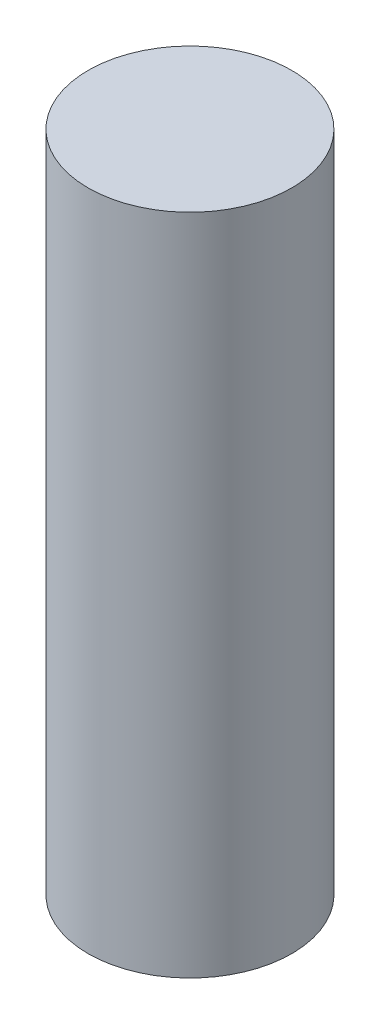
ISO-10303-21;
HEADER;
FILE_DESCRIPTION(('STEP AP214'),'2;1');
FILE_NAME('part.step','',(''),(''),'','','');
FILE_SCHEMA(('AUTOMOTIVE_DESIGN { 1 0 10303 214 1 1 1 1 }'));
ENDSEC;
DATA;
#1=APPLICATION_CONTEXT('core data for automotive mechanical design processes');
#2=APPLICATION_PROTOCOL_DEFINITION('international standard','automotive_design',2000,#1);
#3=PRODUCT_CONTEXT('',#1,'mechanical');
#4=PRODUCT('Part','Part','',(#3));
#5=PRODUCT_RELATED_PRODUCT_CATEGORY('part','',(#4));
#6=PRODUCT_DEFINITION_FORMATION('','',#4);
#7=PRODUCT_DEFINITION_CONTEXT('part definition',#1,'design');
#8=PRODUCT_DEFINITION('design','',#6,#7);
#9=PRODUCT_DEFINITION_SHAPE('','',#8);
#10=(LENGTH_UNIT() NAMED_UNIT(*) SI_UNIT(.MILLI.,.METRE.));
#11=(NAMED_UNIT(*) PLANE_ANGLE_UNIT() SI_UNIT($,.RADIAN.));
#12=(NAMED_UNIT(*) SI_UNIT($,.STERADIAN.) SOLID_ANGLE_UNIT());
#13=UNCERTAINTY_MEASURE_WITH_UNIT(LENGTH_MEASURE(1.E-05),#10,'distance_accuracy_value','');
#14=(GEOMETRIC_REPRESENTATION_CONTEXT(3) GLOBAL_UNCERTAINTY_ASSIGNED_CONTEXT((#13)) GLOBAL_UNIT_ASSIGNED_CONTEXT((#10,
#11,#12)) REPRESENTATION_CONTEXT('',''));
#15=CARTESIAN_POINT('',(0.,0.,0.));
#16=DIRECTION('',(0.,0.,1.));
#17=DIRECTION('',(1.,0.,0.));
#18=AXIS2_PLACEMENT_3D('',#15,#16,#17);
#19=CARTESIAN_POINT('',(0.,26.05,0.));
#20=DIRECTION('',(0.,-1.,0.));
#21=DIRECTION('',(0.,0.,-1.));
#22=AXIS2_PLACEMENT_3D('',#19,#20,#21);
#23=CYLINDRICAL_SURFACE('',#22,4.);
#24=CARTESIAN_POINT('',(0.,26.05,0.));
#25=DIRECTION('',(0.,1.,0.));
#26=DIRECTION('',(0.,0.,1.));
#27=AXIS2_PLACEMENT_3D('',#24,#25,#26);
#28=CIRCLE('',#27,4.);
#29=CARTESIAN_POINT('',(0.,26.05,4.));
#30=VERTEX_POINT('',#29);
#31=EDGE_CURVE('E10',#30,#30,#28,.T.);
#32=ORIENTED_EDGE('',*,*,#31,.F.);
#33=EDGE_LOOP('',(#32));
#34=FACE_BOUND('',#33,.T.);
#35=CARTESIAN_POINT('',(0.,0.,0.));
#36=DIRECTION('',(0.,1.,0.));
#37=DIRECTION('',(0.,0.,1.));
#38=AXIS2_PLACEMENT_3D('',#35,#36,#37);
#39=CIRCLE('',#38,4.);
#40=CARTESIAN_POINT('',(0.,0.,4.));
#41=VERTEX_POINT('',#40);
#42=EDGE_CURVE('E40',#41,#41,#39,.T.);
#43=ORIENTED_EDGE('',*,*,#42,.T.);
#44=EDGE_LOOP('',(#43));
#45=FACE_BOUND('',#44,.T.);
#46=ADVANCED_FACE('F37',(#34,#45),#23,.T.);
#47=CARTESIAN_POINT('',(0.,26.05,0.));
#48=DIRECTION('',(0.,1.,0.));
#49=DIRECTION('',(0.,0.,1.));
#50=AXIS2_PLACEMENT_3D('',#47,#48,#49);
#51=PLANE('',#50);
#52=ORIENTED_EDGE('',*,*,#31,.T.);
#53=EDGE_LOOP('',(#52));
#54=FACE_BOUND('',#53,.T.);
#55=ADVANCED_FACE('F52',(#54),#51,.T.);
#56=CARTESIAN_POINT('',(0.,0.,0.));
#57=DIRECTION('',(0.,1.,0.));
#58=DIRECTION('',(0.,0.,1.));
#59=AXIS2_PLACEMENT_3D('',#56,#57,#58);
#60=PLANE('',#59);
#61=ORIENTED_EDGE('',*,*,#42,.F.);
#62=EDGE_LOOP('',(#61));
#63=FACE_BOUND('',#62,.T.);
#64=ADVANCED_FACE('F50',(#63),#60,.F.);
#65=CLOSED_SHELL('',(#46,#55,#64));
#66=MANIFOLD_SOLID_BREP('B2',#65);
#67=ADVANCED_BREP_SHAPE_REPRESENTATION('',(#18,#66),#14);
#68=SHAPE_DEFINITION_REPRESENTATION(#9,#67);
ENDSEC;
END-ISO-10303-21;
